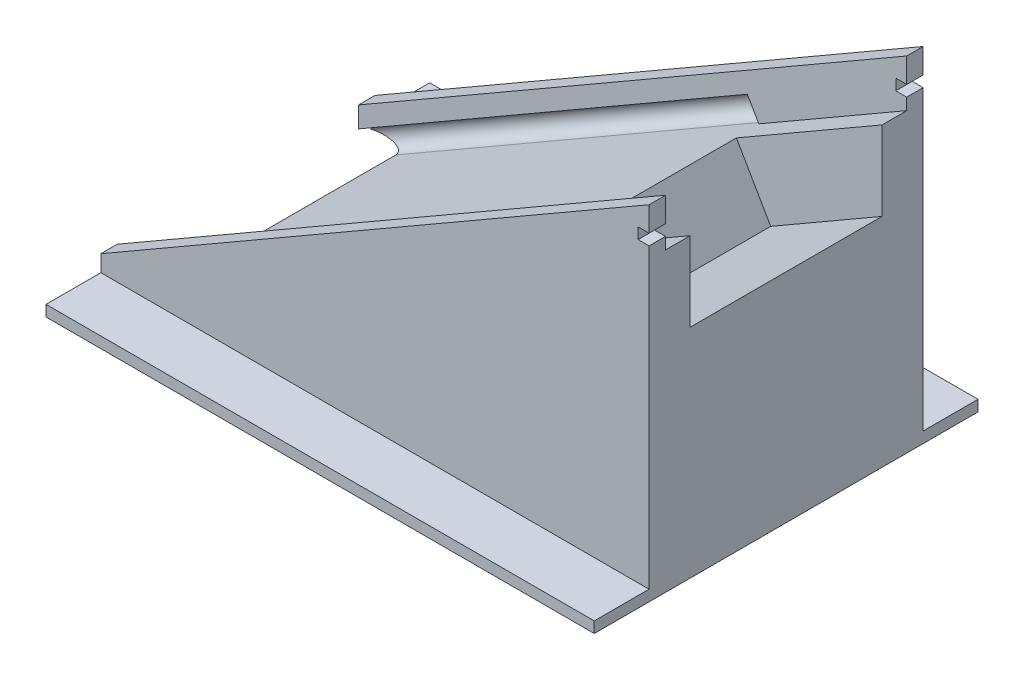
ISO-10303-21;
HEADER;
FILE_DESCRIPTION(('STEP AP214'),'2;1');
FILE_NAME('part.step','',(''),(''),'','','');
FILE_SCHEMA(('AUTOMOTIVE_DESIGN { 1 0 10303 214 1 1 1 1 }'));
ENDSEC;
DATA;
#1=APPLICATION_CONTEXT('core data for automotive mechanical design processes');
#2=APPLICATION_PROTOCOL_DEFINITION('international standard','automotive_design',2000,#1);
#3=PRODUCT_CONTEXT('',#1,'mechanical');
#4=PRODUCT('Part','Part','',(#3));
#5=PRODUCT_RELATED_PRODUCT_CATEGORY('part','',(#4));
#6=PRODUCT_DEFINITION_FORMATION('','',#4);
#7=PRODUCT_DEFINITION_CONTEXT('part definition',#1,'design');
#8=PRODUCT_DEFINITION('design','',#6,#7);
#9=PRODUCT_DEFINITION_SHAPE('','',#8);
#10=(LENGTH_UNIT() NAMED_UNIT(*) SI_UNIT(.MILLI.,.METRE.));
#11=(NAMED_UNIT(*) PLANE_ANGLE_UNIT() SI_UNIT($,.RADIAN.));
#12=(NAMED_UNIT(*) SI_UNIT($,.STERADIAN.) SOLID_ANGLE_UNIT());
#13=UNCERTAINTY_MEASURE_WITH_UNIT(LENGTH_MEASURE(1.E-05),#10,'distance_accuracy_value','');
#14=(GEOMETRIC_REPRESENTATION_CONTEXT(3) GLOBAL_UNCERTAINTY_ASSIGNED_CONTEXT((#13)) GLOBAL_UNIT_ASSIGNED_CONTEXT((#10,
#11,#12)) REPRESENTATION_CONTEXT('',''));
#15=CARTESIAN_POINT('',(0.,0.,0.));
#16=DIRECTION('',(0.,0.,1.));
#17=DIRECTION('',(1.,0.,0.));
#18=AXIS2_PLACEMENT_3D('',#15,#16,#17);
#19=CARTESIAN_POINT('',(50.,2.,35.));
#20=DIRECTION('',(-1.,0.,0.));
#21=DIRECTION('',(0.,0.,1.));
#22=AXIS2_PLACEMENT_3D('',#19,#20,#21);
#23=PLANE('',#22);
#24=DIRECTION('',(0.,1.,0.));
#25=VECTOR('',#24,1.);
#26=CARTESIAN_POINT('',(50.,62.7350269189618,25.));
#27=LINE('',#26,#25);
#28=CARTESIAN_POINT('',(50.,58.2350269189618,25.));
#29=VERTEX_POINT('',#28);
#30=CARTESIAN_POINT('',(50.,62.7350269189618,25.));
#31=VERTEX_POINT('',#30);
#32=EDGE_CURVE('E447',#29,#31,#27,.T.);
#33=ORIENTED_EDGE('',*,*,#32,.F.);
#34=DIRECTION('',(0.,0.,1.));
#35=VECTOR('',#34,1.);
#36=CARTESIAN_POINT('',(50.,58.2350269189618,25.));
#37=LINE('',#36,#35);
#38=CARTESIAN_POINT('',(50.,58.2350269189618,22.));
#39=VERTEX_POINT('',#38);
#40=EDGE_CURVE('E261',#39,#29,#37,.T.);
#41=ORIENTED_EDGE('',*,*,#40,.F.);
#42=DIRECTION('',(0.,1.,0.));
#43=VECTOR('',#42,1.);
#44=CARTESIAN_POINT('',(50.,2.,22.));
#45=LINE('',#44,#43);
#46=CARTESIAN_POINT('',(50.,62.7350269189619,22.));
#47=VERTEX_POINT('',#46);
#48=EDGE_CURVE('E342',#39,#47,#45,.T.);
#49=ORIENTED_EDGE('',*,*,#48,.T.);
#50=DIRECTION('',(0.,0.,-1.));
#51=VECTOR('',#50,1.);
#52=CARTESIAN_POINT('',(50.,62.7350269189618,25.));
#53=LINE('',#52,#51);
#54=EDGE_CURVE('E473',#31,#47,#53,.T.);
#55=ORIENTED_EDGE('',*,*,#54,.F.);
#56=EDGE_LOOP('',(#33,#41,#49,#55));
#57=FACE_BOUND('',#56,.T.);
#58=ADVANCED_FACE('F40',(#57),#23,.F.);
#59=CARTESIAN_POINT('',(50.,54.0971324415937,22.));
#60=VERTEX_POINT('',#59);
#61=CARTESIAN_POINT('',(50.,56.2350269189618,22.));
#62=VERTEX_POINT('',#61);
#63=EDGE_CURVE('E337',#60,#62,#45,.T.);
#64=ORIENTED_EDGE('',*,*,#63,.T.);
#65=DIRECTION('',(0.,0.,-1.));
#66=VECTOR('',#65,1.);
#67=CARTESIAN_POINT('',(50.,56.2350269189618,25.));
#68=LINE('',#67,#66);
#69=CARTESIAN_POINT('',(50.,56.2350269189618,25.));
#70=VERTEX_POINT('',#69);
#71=EDGE_CURVE('E300',#70,#62,#68,.T.);
#72=ORIENTED_EDGE('',*,*,#71,.F.);
#73=CARTESIAN_POINT('',(50.,2.,25.));
#74=VERTEX_POINT('',#73);
#75=EDGE_CURVE('E267',#74,#70,#27,.T.);
#76=ORIENTED_EDGE('',*,*,#75,.F.);
#77=DIRECTION('',(0.,0.,-1.));
#78=VECTOR('',#77,1.);
#79=CARTESIAN_POINT('',(50.,2.,35.));
#80=LINE('',#79,#78);
#81=CARTESIAN_POINT('',(50.,2.,35.));
#82=VERTEX_POINT('',#81);
#83=EDGE_CURVE('E478',#82,#74,#80,.T.);
#84=ORIENTED_EDGE('',*,*,#83,.F.);
#85=DIRECTION('',(0.,-1.,0.));
#86=VECTOR('',#85,1.);
#87=CARTESIAN_POINT('',(50.,2.,35.));
#88=LINE('',#87,#86);
#89=CARTESIAN_POINT('',(50.,0.,35.));
#90=VERTEX_POINT('',#89);
#91=EDGE_CURVE('E492',#82,#90,#88,.T.);
#92=ORIENTED_EDGE('',*,*,#91,.T.);
#93=DIRECTION('',(0.,0.,-1.));
#94=VECTOR('',#93,1.);
#95=CARTESIAN_POINT('',(50.,0.,35.));
#96=LINE('',#95,#94);
#97=CARTESIAN_POINT('',(50.,0.,-35.));
#98=VERTEX_POINT('',#97);
#99=EDGE_CURVE('E477',#90,#98,#96,.T.);
#100=ORIENTED_EDGE('',*,*,#99,.T.);
#101=DIRECTION('',(0.,-1.,0.));
#102=VECTOR('',#101,1.);
#103=CARTESIAN_POINT('',(50.,2.,-35.));
#104=LINE('',#103,#102);
#105=CARTESIAN_POINT('',(50.,2.,-35.));
#106=VERTEX_POINT('',#105);
#107=EDGE_CURVE('E518',#106,#98,#104,.T.);
#108=ORIENTED_EDGE('',*,*,#107,.F.);
#109=CARTESIAN_POINT('',(50.,2.,-25.));
#110=VERTEX_POINT('',#109);
#111=EDGE_CURVE('E482',#110,#106,#80,.T.);
#112=ORIENTED_EDGE('',*,*,#111,.F.);
#113=DIRECTION('',(0.,1.,0.));
#114=VECTOR('',#113,1.);
#115=CARTESIAN_POINT('',(50.,62.7350269189618,-25.));
#116=LINE('',#115,#114);
#117=CARTESIAN_POINT('',(50.,56.2350269189618,-25.));
#118=VERTEX_POINT('',#117);
#119=EDGE_CURVE('E461',#110,#118,#116,.T.);
#120=ORIENTED_EDGE('',*,*,#119,.T.);
#121=DIRECTION('',(0.,0.,-1.));
#122=VECTOR('',#121,1.);
#123=CARTESIAN_POINT('',(50.,56.2350269189618,-25.));
#124=LINE('',#123,#122);
#125=CARTESIAN_POINT('',(50.,56.2350269189618,-22.));
#126=VERTEX_POINT('',#125);
#127=EDGE_CURVE('E280',#126,#118,#124,.T.);
#128=ORIENTED_EDGE('',*,*,#127,.F.);
#129=DIRECTION('',(0.,-1.,0.));
#130=VECTOR('',#129,1.);
#131=CARTESIAN_POINT('',(50.,2.,-22.));
#132=LINE('',#131,#130);
#133=CARTESIAN_POINT('',(50.,54.0971324415937,-22.));
#134=VERTEX_POINT('',#133);
#135=EDGE_CURVE('E341',#126,#134,#132,.T.);
#136=ORIENTED_EDGE('',*,*,#135,.T.);
#137=DIRECTION('',(0.,0.,1.));
#138=VECTOR('',#137,1.);
#139=CARTESIAN_POINT('',(50.,54.0971324415937,35.));
#140=LINE('',#139,#138);
#141=CARTESIAN_POINT('',(50.,54.0971324415937,-17.5));
#142=VERTEX_POINT('',#141);
#143=EDGE_CURVE('E336',#134,#142,#140,.T.);
#144=ORIENTED_EDGE('',*,*,#143,.T.);
#145=DIRECTION('',(0.,-1.,0.));
#146=VECTOR('',#145,1.);
#147=CARTESIAN_POINT('',(50.,2.,-17.5));
#148=LINE('',#147,#146);
#149=CARTESIAN_POINT('',(50.,39.6410161513769,-17.5));
#150=VERTEX_POINT('',#149);
#151=EDGE_CURVE('E428',#142,#150,#148,.T.);
#152=ORIENTED_EDGE('',*,*,#151,.T.);
#153=DIRECTION('',(0.,0.,1.));
#154=VECTOR('',#153,1.);
#155=CARTESIAN_POINT('',(50.,39.6410161513769,35.));
#156=LINE('',#155,#154);
#157=CARTESIAN_POINT('',(50.,39.6410161513769,17.5));
#158=VERTEX_POINT('',#157);
#159=EDGE_CURVE('E522',#150,#158,#156,.T.);
#160=ORIENTED_EDGE('',*,*,#159,.T.);
#161=DIRECTION('',(0.,1.,0.));
#162=VECTOR('',#161,1.);
#163=CARTESIAN_POINT('',(50.,2.,17.5));
#164=LINE('',#163,#162);
#165=CARTESIAN_POINT('',(50.,54.0971324415937,17.5));
#166=VERTEX_POINT('',#165);
#167=EDGE_CURVE('E434',#158,#166,#164,.T.);
#168=ORIENTED_EDGE('',*,*,#167,.T.);
#169=EDGE_CURVE('E332',#166,#60,#140,.T.);
#170=ORIENTED_EDGE('',*,*,#169,.T.);
#171=EDGE_LOOP('',(#64,#72,#76,#84,#92,#100,#108,#112,#120,#128,#136,#144,#152,#160,#168,#170));
#172=FACE_BOUND('',#171,.T.);
#173=ADVANCED_FACE('F622',(#172),#23,.F.);
#174=CARTESIAN_POINT('',(-50.,5.,25.));
#175=DIRECTION('',(0.499999999999995,-0.866025403784441,0.));
#176=DIRECTION('',(0.866025403784442,0.499999999999995,0.));
#177=AXIS2_PLACEMENT_3D('',#174,#175,#176);
#178=PLANE('',#177);
#179=DIRECTION('',(-0.866025403784442,-0.499999999999995,0.));
#180=VECTOR('',#179,1.);
#181=CARTESIAN_POINT('',(131.662207683997,109.882724507936,-22.));
#182=LINE('',#181,#180);
#183=CARTESIAN_POINT('',(50.,62.7350269189619,-22.));
#184=VERTEX_POINT('',#183);
#185=CARTESIAN_POINT('',(-50.,4.99999999999999,-22.));
#186=VERTEX_POINT('',#185);
#187=EDGE_CURVE('E380',#184,#186,#182,.T.);
#188=ORIENTED_EDGE('',*,*,#187,.F.);
#189=CARTESIAN_POINT('',(50.,62.7350269189618,-25.));
#190=VERTEX_POINT('',#189);
#191=EDGE_CURVE('E472',#184,#190,#53,.T.);
#192=ORIENTED_EDGE('',*,*,#191,.T.);
#193=DIRECTION('',(-0.866025403784442,-0.499999999999995,0.));
#194=VECTOR('',#193,1.);
#195=CARTESIAN_POINT('',(-50.,5.,-25.));
#196=LINE('',#195,#194);
#197=CARTESIAN_POINT('',(-50.,5.,-25.));
#198=VERTEX_POINT('',#197);
#199=EDGE_CURVE('E444',#190,#198,#196,.T.);
#200=ORIENTED_EDGE('',*,*,#199,.T.);
#201=DIRECTION('',(0.,0.,-1.));
#202=VECTOR('',#201,1.);
#203=CARTESIAN_POINT('',(-50.,5.,25.));
#204=LINE('',#203,#202);
#205=EDGE_CURVE('E453',#186,#198,#204,.T.);
#206=ORIENTED_EDGE('',*,*,#205,.F.);
#207=EDGE_LOOP('',(#188,#192,#200,#206));
#208=FACE_BOUND('',#207,.T.);
#209=ADVANCED_FACE('F564',(#208),#178,.F.);
#210=CARTESIAN_POINT('',(33.9470958122162,19.5993649053888,0.));
#211=DIRECTION('',(-0.866025403784442,-0.499999999999995,0.));
#212=DIRECTION('',(0.499999999999995,-0.866025403784442,0.));
#213=AXIS2_PLACEMENT_3D('',#210,#211,#212);
#214=PLANE('',#213);
#215=DIRECTION('',(0.499999999999995,-0.866025403784441,0.));
#216=VECTOR('',#215,1.);
#217=CARTESIAN_POINT('',(33.9470958122162,19.5993649053888,-22.));
#218=LINE('',#217,#216);
#219=CARTESIAN_POINT('',(20.9223503290604,42.1588858378681,-22.));
#220=VERTEX_POINT('',#219);
#221=CARTESIAN_POINT('',(23.0223503290603,38.5215791419734,-22.));
#222=VERTEX_POINT('',#221);
#223=EDGE_CURVE('E12',#220,#222,#218,.T.);
#224=ORIENTED_EDGE('',*,*,#223,.F.);
#225=DIRECTION('',(0.,0.,1.));
#226=VECTOR('',#225,1.);
#227=CARTESIAN_POINT('',(20.9223503290604,42.1588858378681,-22.));
#228=LINE('',#227,#226);
#229=CARTESIAN_POINT('',(20.9223503290604,42.1588858378681,-22.5));
#230=VERTEX_POINT('',#229);
#231=EDGE_CURVE('E348',#230,#220,#228,.T.);
#232=ORIENTED_EDGE('',*,*,#231,.F.);
#233=CARTESIAN_POINT('',(21.9723503290604,40.3402324899208,-22.5));
#234=DIRECTION('',(-0.866025403784442,-0.499999999999995,0.));
#235=DIRECTION('',(0.499999999999995,-0.866025403784442,0.));
#236=AXIS2_PLACEMENT_3D('',#233,#234,#235);
#237=CIRCLE('',#236,2.1);
#238=CARTESIAN_POINT('',(23.0223503290603,38.5215791419735,-22.5));
#239=VERTEX_POINT('',#238);
#240=EDGE_CURVE('E352',#239,#230,#237,.F.);
#241=ORIENTED_EDGE('',*,*,#240,.F.);
#242=DIRECTION('',(0.,0.,-1.));
#243=VECTOR('',#242,1.);
#244=CARTESIAN_POINT('',(23.0223503290603,38.5215791419734,22.5));
#245=LINE('',#244,#243);
#246=EDGE_CURVE('E356',#222,#239,#245,.T.);
#247=ORIENTED_EDGE('',*,*,#246,.F.);
#248=EDGE_LOOP('',(#224,#232,#241,#247));
#249=FACE_BOUND('',#248,.T.);
#250=ADVANCED_FACE('F555',(#249),#214,.T.);
#251=CARTESIAN_POINT('',(-50.,2.,35.));
#252=DIRECTION('',(1.,0.,0.));
#253=DIRECTION('',(0.,0.,-1.));
#254=AXIS2_PLACEMENT_3D('',#251,#252,#253);
#255=PLANE('',#254);
#256=DIRECTION('',(0.,0.,1.));
#257=VECTOR('',#256,1.);
#258=CARTESIAN_POINT('',(-50.,0.,35.));
#259=LINE('',#258,#257);
#260=CARTESIAN_POINT('',(-50.,0.,-35.));
#261=VERTEX_POINT('',#260);
#262=CARTESIAN_POINT('',(-50.,0.,-24.3183593622109));
#263=VERTEX_POINT('',#262);
#264=EDGE_CURVE('E500',#261,#263,#259,.T.);
#265=ORIENTED_EDGE('',*,*,#264,.T.);
#266=CARTESIAN_POINT('',(-50.,-1.21302334677169,-22.5));
#267=DIRECTION('',(1.,0.,0.));
#268=DIRECTION('',(0.,-1.,0.));
#269=AXIS2_PLACEMENT_3D('',#266,#267,#268);
#270=ELLIPSE('',#269,2.42487113059642,2.1);
#271=CARTESIAN_POINT('',(-50.,1.21184778382472,-22.5));
#272=VERTEX_POINT('',#271);
#273=EDGE_CURVE('E404',#263,#272,#270,.T.);
#274=ORIENTED_EDGE('',*,*,#273,.T.);
#275=DIRECTION('',(0.,0.,1.));
#276=VECTOR('',#275,1.);
#277=CARTESIAN_POINT('',(-50.,1.21184778382474,35.));
#278=LINE('',#277,#276);
#279=CARTESIAN_POINT('',(-50.,1.21184778382474,-22.));
#280=VERTEX_POINT('',#279);
#281=EDGE_CURVE('E49',#272,#280,#278,.T.);
#282=ORIENTED_EDGE('',*,*,#281,.T.);
#283=DIRECTION('',(0.,1.,0.));
#284=VECTOR('',#283,1.);
#285=CARTESIAN_POINT('',(-50.,2.,-22.));
#286=LINE('',#285,#284);
#287=EDGE_CURVE('E400',#280,#186,#286,.T.);
#288=ORIENTED_EDGE('',*,*,#287,.T.);
#289=ORIENTED_EDGE('',*,*,#205,.T.);
#290=DIRECTION('',(0.,-1.,0.));
#291=VECTOR('',#290,1.);
#292=CARTESIAN_POINT('',(-50.,2.,-25.));
#293=LINE('',#292,#291);
#294=CARTESIAN_POINT('',(-50.,2.,-25.));
#295=VERTEX_POINT('',#294);
#296=EDGE_CURVE('E438',#198,#295,#293,.T.);
#297=ORIENTED_EDGE('',*,*,#296,.T.);
#298=DIRECTION('',(0.,0.,1.));
#299=VECTOR('',#298,1.);
#300=CARTESIAN_POINT('',(-50.,2.,35.));
#301=LINE('',#300,#299);
#302=CARTESIAN_POINT('',(-50.,2.,-35.));
#303=VERTEX_POINT('',#302);
#304=EDGE_CURVE('E486',#303,#295,#301,.T.);
#305=ORIENTED_EDGE('',*,*,#304,.F.);
#306=DIRECTION('',(0.,-1.,0.));
#307=VECTOR('',#306,1.);
#308=CARTESIAN_POINT('',(-50.,2.,-35.));
#309=LINE('',#308,#307);
#310=EDGE_CURVE('E514',#303,#261,#309,.T.);
#311=ORIENTED_EDGE('',*,*,#310,.T.);
#312=EDGE_LOOP('',(#265,#274,#282,#288,#289,#297,#305,#311));
#313=FACE_BOUND('',#312,.T.);
#314=ADVANCED_FACE('F541',(#313),#255,.F.);
#315=CARTESIAN_POINT('',(0.,2.,0.));
#316=DIRECTION('',(0.,-1.,0.));
#317=DIRECTION('',(0.,0.,-1.));
#318=AXIS2_PLACEMENT_3D('',#315,#316,#317);
#319=PLANE('',#318);
#320=DIRECTION('',(1.,0.,0.));
#321=VECTOR('',#320,1.);
#322=CARTESIAN_POINT('',(50.,2.,25.));
#323=LINE('',#322,#321);
#324=CARTESIAN_POINT('',(-50.,2.,25.));
#325=VERTEX_POINT('',#324);
#326=EDGE_CURVE('E443',#325,#74,#323,.T.);
#327=ORIENTED_EDGE('',*,*,#326,.F.);
#328=CARTESIAN_POINT('',(-50.,2.,35.));
#329=VERTEX_POINT('',#328);
#330=EDGE_CURVE('E485',#325,#329,#301,.T.);
#331=ORIENTED_EDGE('',*,*,#330,.T.);
#332=DIRECTION('',(1.,0.,0.));
#333=VECTOR('',#332,1.);
#334=CARTESIAN_POINT('',(-50.,2.,35.));
#335=LINE('',#334,#333);
#336=EDGE_CURVE('E489',#329,#82,#335,.T.);
#337=ORIENTED_EDGE('',*,*,#336,.T.);
#338=ORIENTED_EDGE('',*,*,#83,.T.);
#339=EDGE_LOOP('',(#327,#331,#337,#338));
#340=FACE_BOUND('',#339,.T.);
#341=ADVANCED_FACE('F625',(#340),#319,.F.);
#342=CARTESIAN_POINT('',(50.,58.2350269189618,-22.));
#343=VERTEX_POINT('',#342);
#344=EDGE_CURVE('E343',#184,#343,#132,.T.);
#345=ORIENTED_EDGE('',*,*,#344,.T.);
#346=DIRECTION('',(0.,0.,1.));
#347=VECTOR('',#346,1.);
#348=CARTESIAN_POINT('',(50.,58.2350269189618,-25.));
#349=LINE('',#348,#347);
#350=CARTESIAN_POINT('',(50.,58.2350269189618,-25.));
#351=VERTEX_POINT('',#350);
#352=EDGE_CURVE('E291',#351,#343,#349,.T.);
#353=ORIENTED_EDGE('',*,*,#352,.F.);
#354=EDGE_CURVE('E460',#351,#190,#116,.T.);
#355=ORIENTED_EDGE('',*,*,#354,.T.);
#356=ORIENTED_EDGE('',*,*,#191,.F.);
#357=EDGE_LOOP('',(#345,#353,#355,#356));
#358=FACE_BOUND('',#357,.T.);
#359=ADVANCED_FACE('F42',(#358),#23,.F.);
#360=CARTESIAN_POINT('',(-50.,2.,-35.));
#361=DIRECTION('',(0.,0.,1.));
#362=DIRECTION('',(1.,0.,0.));
#363=AXIS2_PLACEMENT_3D('',#360,#361,#362);
#364=PLANE('',#363);
#365=DIRECTION('',(-1.,0.,0.));
#366=VECTOR('',#365,1.);
#367=CARTESIAN_POINT('',(-50.,0.,-35.));
#368=LINE('',#367,#366);
#369=EDGE_CURVE('E496',#98,#261,#368,.T.);
#370=ORIENTED_EDGE('',*,*,#369,.T.);
#371=ORIENTED_EDGE('',*,*,#310,.F.);
#372=DIRECTION('',(-1.,0.,0.));
#373=VECTOR('',#372,1.);
#374=CARTESIAN_POINT('',(-50.,2.,-35.));
#375=LINE('',#374,#373);
#376=EDGE_CURVE('E481',#106,#303,#375,.T.);
#377=ORIENTED_EDGE('',*,*,#376,.F.);
#378=ORIENTED_EDGE('',*,*,#107,.T.);
#379=EDGE_LOOP('',(#370,#371,#377,#378));
#380=FACE_BOUND('',#379,.T.);
#381=ADVANCED_FACE('F633',(#380),#364,.F.);
#382=DIRECTION('',(0.,0.,1.));
#383=VECTOR('',#382,1.);
#384=CARTESIAN_POINT('',(-50.,1.21184778382474,35.));
#385=LINE('',#384,#383);
#386=CARTESIAN_POINT('',(-50.,1.21184778382472,22.));
#387=VERTEX_POINT('',#386);
#388=CARTESIAN_POINT('',(-50.,1.21184778382472,22.5));
#389=VERTEX_POINT('',#388);
#390=EDGE_CURVE('E535',#387,#389,#385,.T.);
#391=ORIENTED_EDGE('',*,*,#390,.T.);
#392=CARTESIAN_POINT('',(-50.,-1.21302334677169,22.5));
#393=DIRECTION('',(1.,0.,0.));
#394=DIRECTION('',(0.,-1.,0.));
#395=AXIS2_PLACEMENT_3D('',#392,#393,#394);
#396=ELLIPSE('',#395,2.42487113059642,2.1);
#397=CARTESIAN_POINT('',(-50.,0.,24.3183593622109));
#398=VERTEX_POINT('',#397);
#399=EDGE_CURVE('E408',#389,#398,#396,.T.);
#400=ORIENTED_EDGE('',*,*,#399,.T.);
#401=CARTESIAN_POINT('',(-50.,0.,35.));
#402=VERTEX_POINT('',#401);
#403=EDGE_CURVE('E499',#398,#402,#259,.T.);
#404=ORIENTED_EDGE('',*,*,#403,.T.);
#405=DIRECTION('',(0.,-1.,0.));
#406=VECTOR('',#405,1.);
#407=CARTESIAN_POINT('',(-50.,2.,35.));
#408=LINE('',#407,#406);
#409=EDGE_CURVE('E510',#329,#402,#408,.T.);
#410=ORIENTED_EDGE('',*,*,#409,.F.);
#411=ORIENTED_EDGE('',*,*,#330,.F.);
#412=DIRECTION('',(0.,-1.,0.));
#413=VECTOR('',#412,1.);
#414=CARTESIAN_POINT('',(-50.,2.,25.));
#415=LINE('',#414,#413);
#416=CARTESIAN_POINT('',(-50.,5.,25.));
#417=VERTEX_POINT('',#416);
#418=EDGE_CURVE('E439',#417,#325,#415,.T.);
#419=ORIENTED_EDGE('',*,*,#418,.F.);
#420=CARTESIAN_POINT('',(-50.,4.99999999999999,22.));
#421=VERTEX_POINT('',#420);
#422=EDGE_CURVE('E468',#417,#421,#204,.T.);
#423=ORIENTED_EDGE('',*,*,#422,.T.);
#424=DIRECTION('',(0.,-1.,0.));
#425=VECTOR('',#424,1.);
#426=CARTESIAN_POINT('',(-50.,2.,22.));
#427=LINE('',#426,#425);
#428=EDGE_CURVE('E396',#421,#387,#427,.T.);
#429=ORIENTED_EDGE('',*,*,#428,.T.);
#430=EDGE_LOOP('',(#391,#400,#404,#410,#411,#419,#423,#429));
#431=FACE_BOUND('',#430,.T.);
#432=ADVANCED_FACE('F603',(#431),#255,.F.);
#433=CARTESIAN_POINT('',(-50.,2.,35.));
#434=DIRECTION('',(0.,0.,-1.));
#435=DIRECTION('',(-1.,0.,0.));
#436=AXIS2_PLACEMENT_3D('',#433,#434,#435);
#437=PLANE('',#436);
#438=DIRECTION('',(1.,0.,0.));
#439=VECTOR('',#438,1.);
#440=CARTESIAN_POINT('',(-50.,0.,35.));
#441=LINE('',#440,#439);
#442=EDGE_CURVE('E504',#402,#90,#441,.T.);
#443=ORIENTED_EDGE('',*,*,#442,.T.);
#444=ORIENTED_EDGE('',*,*,#91,.F.);
#445=ORIENTED_EDGE('',*,*,#336,.F.);
#446=ORIENTED_EDGE('',*,*,#409,.T.);
#447=EDGE_LOOP('',(#443,#444,#445,#446));
#448=FACE_BOUND('',#447,.T.);
#449=ADVANCED_FACE('F615',(#448),#437,.F.);
#450=ORIENTED_EDGE('',*,*,#304,.T.);
#451=DIRECTION('',(1.,0.,0.));
#452=VECTOR('',#451,1.);
#453=CARTESIAN_POINT('',(50.,2.,-25.));
#454=LINE('',#453,#452);
#455=EDGE_CURVE('E457',#295,#110,#454,.T.);
#456=ORIENTED_EDGE('',*,*,#455,.T.);
#457=ORIENTED_EDGE('',*,*,#111,.T.);
#458=ORIENTED_EDGE('',*,*,#376,.T.);
#459=EDGE_LOOP('',(#450,#456,#457,#458));
#460=FACE_BOUND('',#459,.T.);
#461=ADVANCED_FACE('F628',(#460),#319,.F.);
#462=CARTESIAN_POINT('',(0.,0.,0.));
#463=DIRECTION('',(0.,-1.,0.));
#464=DIRECTION('',(0.,0.,-1.));
#465=AXIS2_PLACEMENT_3D('',#462,#463,#464);
#466=PLANE('',#465);
#467=CARTESIAN_POINT('',(-47.8989819326242,0.,22.5));
#468=DIRECTION('',(0.,-1.,0.));
#469=DIRECTION('',(-1.,0.,0.));
#470=AXIS2_PLACEMENT_3D('',#467,#468,#469);
#471=ELLIPSE('',#470,4.20000000000004,2.1);
#472=CARTESIAN_POINT('',(-43.6989819326241,0.,22.5));
#473=VERTEX_POINT('',#472);
#474=EDGE_CURVE('E532',#473,#398,#471,.T.);
#475=ORIENTED_EDGE('',*,*,#474,.F.);
#476=DIRECTION('',(0.,0.,1.));
#477=VECTOR('',#476,1.);
#478=CARTESIAN_POINT('',(-43.6989819326241,0.,0.));
#479=LINE('',#478,#477);
#480=CARTESIAN_POINT('',(-43.6989819326241,0.,-22.5));
#481=VERTEX_POINT('',#480);
#482=EDGE_CURVE('E529',#481,#473,#479,.T.);
#483=ORIENTED_EDGE('',*,*,#482,.F.);
#484=CARTESIAN_POINT('',(-47.8989819326242,0.,-22.5));
#485=DIRECTION('',(0.,-1.,0.));
#486=DIRECTION('',(-1.,0.,0.));
#487=AXIS2_PLACEMENT_3D('',#484,#485,#486);
#488=ELLIPSE('',#487,4.20000000000004,2.1);
#489=EDGE_CURVE('E526',#263,#481,#488,.T.);
#490=ORIENTED_EDGE('',*,*,#489,.F.);
#491=ORIENTED_EDGE('',*,*,#264,.F.);
#492=ORIENTED_EDGE('',*,*,#369,.F.);
#493=ORIENTED_EDGE('',*,*,#99,.F.);
#494=ORIENTED_EDGE('',*,*,#442,.F.);
#495=ORIENTED_EDGE('',*,*,#403,.F.);
#496=EDGE_LOOP('',(#475,#483,#490,#491,#492,#493,#494,#495));
#497=FACE_BOUND('',#496,.T.);
#498=ADVANCED_FACE('F618',(#497),#466,.T.);
#499=ORIENTED_EDGE('',*,*,#54,.T.);
#500=DIRECTION('',(-0.866025403784442,-0.499999999999995,0.));
#501=VECTOR('',#500,1.);
#502=CARTESIAN_POINT('',(131.662207683997,109.882724507936,22.));
#503=LINE('',#502,#501);
#504=EDGE_CURVE('E383',#47,#421,#503,.T.);
#505=ORIENTED_EDGE('',*,*,#504,.T.);
#506=ORIENTED_EDGE('',*,*,#422,.F.);
#507=DIRECTION('',(-0.866025403784442,-0.499999999999995,0.));
#508=VECTOR('',#507,1.);
#509=CARTESIAN_POINT('',(-50.,5.,25.));
#510=LINE('',#509,#508);
#511=EDGE_CURVE('E450',#31,#417,#510,.T.);
#512=ORIENTED_EDGE('',*,*,#511,.F.);
#513=EDGE_LOOP('',(#499,#505,#506,#512));
#514=FACE_BOUND('',#513,.T.);
#515=ADVANCED_FACE('F600',(#514),#178,.F.);
#516=CARTESIAN_POINT('',(0.,0.,25.));
#517=DIRECTION('',(0.,0.,1.));
#518=DIRECTION('',(1.,0.,0.));
#519=AXIS2_PLACEMENT_3D('',#516,#517,#518);
#520=PLANE('',#519);
#521=DIRECTION('',(1.,0.,0.));
#522=VECTOR('',#521,1.);
#523=CARTESIAN_POINT('',(48.,58.2350269189618,25.));
#524=LINE('',#523,#522);
#525=CARTESIAN_POINT('',(48.,58.2350269189618,25.));
#526=VERTEX_POINT('',#525);
#527=EDGE_CURVE('E314',#526,#29,#524,.T.);
#528=ORIENTED_EDGE('',*,*,#527,.T.);
#529=ORIENTED_EDGE('',*,*,#32,.T.);
#530=ORIENTED_EDGE('',*,*,#511,.T.);
#531=ORIENTED_EDGE('',*,*,#418,.T.);
#532=ORIENTED_EDGE('',*,*,#326,.T.);
#533=ORIENTED_EDGE('',*,*,#75,.T.);
#534=DIRECTION('',(1.,0.,0.));
#535=VECTOR('',#534,1.);
#536=CARTESIAN_POINT('',(48.,56.2350269189618,25.));
#537=LINE('',#536,#535);
#538=CARTESIAN_POINT('',(48.,56.2350269189618,25.));
#539=VERTEX_POINT('',#538);
#540=EDGE_CURVE('E244',#539,#70,#537,.T.);
#541=ORIENTED_EDGE('',*,*,#540,.F.);
#542=DIRECTION('',(0.,-1.,0.));
#543=VECTOR('',#542,1.);
#544=CARTESIAN_POINT('',(48.,56.2350269189618,25.));
#545=LINE('',#544,#543);
#546=EDGE_CURVE('E251',#526,#539,#545,.T.);
#547=ORIENTED_EDGE('',*,*,#546,.F.);
#548=EDGE_LOOP('',(#528,#529,#530,#531,#532,#533,#541,#547));
#549=FACE_BOUND('',#548,.T.);
#550=ADVANCED_FACE('F264',(#549),#520,.T.);
#551=CARTESIAN_POINT('',(0.,0.,-25.));
#552=DIRECTION('',(0.,0.,1.));
#553=DIRECTION('',(1.,0.,0.));
#554=AXIS2_PLACEMENT_3D('',#551,#552,#553);
#555=PLANE('',#554);
#556=DIRECTION('',(0.,1.,0.));
#557=VECTOR('',#556,1.);
#558=CARTESIAN_POINT('',(48.,56.2350269189618,-25.));
#559=LINE('',#558,#557);
#560=CARTESIAN_POINT('',(48.,56.2350269189618,-25.));
#561=VERTEX_POINT('',#560);
#562=CARTESIAN_POINT('',(48.,58.2350269189618,-25.));
#563=VERTEX_POINT('',#562);
#564=EDGE_CURVE('E277',#561,#563,#559,.T.);
#565=ORIENTED_EDGE('',*,*,#564,.F.);
#566=DIRECTION('',(1.,0.,0.));
#567=VECTOR('',#566,1.);
#568=CARTESIAN_POINT('',(48.,56.2350269189618,-25.));
#569=LINE('',#568,#567);
#570=EDGE_CURVE('E296',#561,#118,#569,.T.);
#571=ORIENTED_EDGE('',*,*,#570,.T.);
#572=ORIENTED_EDGE('',*,*,#119,.F.);
#573=ORIENTED_EDGE('',*,*,#455,.F.);
#574=ORIENTED_EDGE('',*,*,#296,.F.);
#575=ORIENTED_EDGE('',*,*,#199,.F.);
#576=ORIENTED_EDGE('',*,*,#354,.F.);
#577=DIRECTION('',(1.,0.,0.));
#578=VECTOR('',#577,1.);
#579=CARTESIAN_POINT('',(48.,58.2350269189618,-25.));
#580=LINE('',#579,#578);
#581=EDGE_CURVE('E290',#563,#351,#580,.T.);
#582=ORIENTED_EDGE('',*,*,#581,.F.);
#583=EDGE_LOOP('',(#565,#571,#572,#573,#574,#575,#576,#582));
#584=FACE_BOUND('',#583,.T.);
#585=ADVANCED_FACE('F658',(#584),#555,.F.);
#586=CARTESIAN_POINT('',(-4.66506350946094,8.08012701892201,0.));
#587=DIRECTION('',(0.499999999999995,-0.866025403784441,0.));
#588=DIRECTION('',(0.866025403784441,0.499999999999995,0.));
#589=AXIS2_PLACEMENT_3D('',#586,#587,#588);
#590=PLANE('',#589);
#591=DIRECTION('',(-0.866025403784441,-0.499999999999995,0.));
#592=VECTOR('',#591,1.);
#593=CARTESIAN_POINT('',(59.9999999999999,45.414518843273,-17.5));
#594=LINE('',#593,#592);
#595=CARTESIAN_POINT('',(29.6891108675445,27.9145188432732,-17.5));
#596=VERTEX_POINT('',#595);
#597=EDGE_CURVE('E412',#150,#596,#594,.T.);
#598=ORIENTED_EDGE('',*,*,#597,.T.);
#599=DIRECTION('',(0.,0.,1.));
#600=VECTOR('',#599,1.);
#601=CARTESIAN_POINT('',(29.6891108675445,27.9145188432732,-17.5));
#602=LINE('',#601,#600);
#603=CARTESIAN_POINT('',(29.6891108675445,27.9145188432732,17.5));
#604=VERTEX_POINT('',#603);
#605=EDGE_CURVE('E415',#596,#604,#602,.T.);
#606=ORIENTED_EDGE('',*,*,#605,.T.);
#607=DIRECTION('',(0.866025403784441,0.499999999999995,0.));
#608=VECTOR('',#607,1.);
#609=CARTESIAN_POINT('',(59.9999999999999,45.414518843273,17.5));
#610=LINE('',#609,#608);
#611=EDGE_CURVE('E419',#604,#158,#610,.T.);
#612=ORIENTED_EDGE('',*,*,#611,.T.);
#613=ORIENTED_EDGE('',*,*,#159,.F.);
#614=EDGE_LOOP('',(#598,#606,#612,#613));
#615=FACE_BOUND('',#614,.T.);
#616=ADVANCED_FACE('F724',(#615),#590,.F.);
#617=CARTESIAN_POINT('',(59.9999999999999,45.414518843273,17.5));
#618=DIRECTION('',(0.,0.,1.));
#619=DIRECTION('',(1.,0.,0.));
#620=AXIS2_PLACEMENT_3D('',#617,#618,#619);
#621=PLANE('',#620);
#622=DIRECTION('',(-0.499999999999995,0.866025403784441,0.));
#623=VECTOR('',#622,1.);
#624=CARTESIAN_POINT('',(29.6891108675445,27.9145188432732,17.5));
#625=LINE('',#624,#623);
#626=CARTESIAN_POINT('',(23.4294288938496,38.7566060609359,17.5));
#627=VERTEX_POINT('',#626);
#628=EDGE_CURVE('E424',#604,#627,#625,.T.);
#629=ORIENTED_EDGE('',*,*,#628,.T.);
#630=DIRECTION('',(0.866025403784441,0.499999999999995,0.));
#631=VECTOR('',#630,1.);
#632=CARTESIAN_POINT('',(53.740318026305,56.2566060609357,17.5));
#633=LINE('',#632,#631);
#634=EDGE_CURVE('E328',#627,#166,#633,.T.);
#635=ORIENTED_EDGE('',*,*,#634,.T.);
#636=ORIENTED_EDGE('',*,*,#167,.F.);
#637=ORIENTED_EDGE('',*,*,#611,.F.);
#638=EDGE_LOOP('',(#629,#635,#636,#637));
#639=FACE_BOUND('',#638,.T.);
#640=ADVANCED_FACE('F727',(#639),#621,.F.);
#641=CARTESIAN_POINT('',(59.9999999999999,45.414518843273,-17.5));
#642=DIRECTION('',(0.,0.,-1.));
#643=DIRECTION('',(-1.,0.,0.));
#644=AXIS2_PLACEMENT_3D('',#641,#642,#643);
#645=PLANE('',#644);
#646=ORIENTED_EDGE('',*,*,#151,.F.);
#647=DIRECTION('',(-0.866025403784441,-0.499999999999995,0.));
#648=VECTOR('',#647,1.);
#649=CARTESIAN_POINT('',(53.740318026305,56.2566060609357,-17.5));
#650=LINE('',#649,#648);
#651=CARTESIAN_POINT('',(23.4294288938496,38.7566060609359,-17.5));
#652=VERTEX_POINT('',#651);
#653=EDGE_CURVE('E324',#142,#652,#650,.T.);
#654=ORIENTED_EDGE('',*,*,#653,.T.);
#655=DIRECTION('',(-0.499999999999995,0.866025403784441,0.));
#656=VECTOR('',#655,1.);
#657=CARTESIAN_POINT('',(29.6891108675445,27.9145188432732,-17.5));
#658=LINE('',#657,#656);
#659=EDGE_CURVE('E423',#596,#652,#658,.T.);
#660=ORIENTED_EDGE('',*,*,#659,.F.);
#661=ORIENTED_EDGE('',*,*,#597,.F.);
#662=EDGE_LOOP('',(#646,#654,#660,#661));
#663=FACE_BOUND('',#662,.T.);
#664=ADVANCED_FACE('F731',(#663),#645,.F.);
#665=CARTESIAN_POINT('',(29.6891108675445,27.9145188432732,-17.5));
#666=DIRECTION('',(-0.866025403784441,-0.499999999999995,0.));
#667=DIRECTION('',(0.499999999999995,-0.866025403784441,0.));
#668=AXIS2_PLACEMENT_3D('',#665,#666,#667);
#669=PLANE('',#668);
#670=ORIENTED_EDGE('',*,*,#659,.T.);
#671=DIRECTION('',(0.,0.,1.));
#672=VECTOR('',#671,1.);
#673=CARTESIAN_POINT('',(23.4294288938496,38.7566060609359,-17.5));
#674=LINE('',#673,#672);
#675=EDGE_CURVE('E318',#652,#627,#674,.T.);
#676=ORIENTED_EDGE('',*,*,#675,.T.);
#677=ORIENTED_EDGE('',*,*,#628,.F.);
#678=ORIENTED_EDGE('',*,*,#605,.F.);
#679=EDGE_LOOP('',(#670,#676,#677,#678));
#680=FACE_BOUND('',#679,.T.);
#681=ADVANCED_FACE('F713',(#680),#669,.F.);
#682=CARTESIAN_POINT('',(133.302525710302,107.041610345805,-22.));
#683=DIRECTION('',(-0.499999999999995,0.866025403784442,0.));
#684=DIRECTION('',(-0.866025403784442,-0.499999999999995,0.));
#685=AXIS2_PLACEMENT_3D('',#682,#683,#684);
#686=PLANE('',#685);
#687=DIRECTION('',(-0.866025403784442,-0.499999999999995,0.));
#688=VECTOR('',#687,1.);
#689=CARTESIAN_POINT('',(133.302525710302,107.041610345805,-22.5));
#690=LINE('',#689,#688);
#691=EDGE_CURVE('E372',#230,#272,#690,.T.);
#692=ORIENTED_EDGE('',*,*,#691,.F.);
#693=ORIENTED_EDGE('',*,*,#231,.T.);
#694=DIRECTION('',(-0.866025403784442,-0.499999999999995,0.));
#695=VECTOR('',#694,1.);
#696=CARTESIAN_POINT('',(133.302525710302,107.041610345805,-22.));
#697=LINE('',#696,#695);
#698=EDGE_CURVE('E376',#220,#280,#697,.T.);
#699=ORIENTED_EDGE('',*,*,#698,.T.);
#700=ORIENTED_EDGE('',*,*,#281,.F.);
#701=EDGE_LOOP('',(#692,#693,#699,#700));
#702=FACE_BOUND('',#701,.T.);
#703=ADVANCED_FACE('F545',(#702),#686,.F.);
#704=CARTESIAN_POINT('',(133.302525710302,107.041610345805,22.5));
#705=DIRECTION('',(-0.499999999999995,0.866025403784442,0.));
#706=DIRECTION('',(-0.866025403784442,-0.499999999999995,0.));
#707=AXIS2_PLACEMENT_3D('',#704,#705,#706);
#708=PLANE('',#707);
#709=DIRECTION('',(-0.866025403784442,-0.499999999999995,0.));
#710=VECTOR('',#709,1.);
#711=CARTESIAN_POINT('',(133.302525710302,107.041610345805,22.));
#712=LINE('',#711,#710);
#713=CARTESIAN_POINT('',(20.9223503290604,42.1588858378681,22.));
#714=VERTEX_POINT('',#713);
#715=EDGE_CURVE('E387',#714,#387,#712,.T.);
#716=ORIENTED_EDGE('',*,*,#715,.F.);
#717=DIRECTION('',(0.,0.,1.));
#718=VECTOR('',#717,1.);
#719=CARTESIAN_POINT('',(20.9223503290604,42.1588858378681,22.5));
#720=LINE('',#719,#718);
#721=CARTESIAN_POINT('',(20.9223503290604,42.1588858378681,22.5));
#722=VERTEX_POINT('',#721);
#723=EDGE_CURVE('E364',#714,#722,#720,.T.);
#724=ORIENTED_EDGE('',*,*,#723,.T.);
#725=DIRECTION('',(-0.866025403784442,-0.499999999999995,0.));
#726=VECTOR('',#725,1.);
#727=CARTESIAN_POINT('',(133.302525710302,107.041610345805,22.5));
#728=LINE('',#727,#726);
#729=EDGE_CURVE('E347',#722,#389,#728,.T.);
#730=ORIENTED_EDGE('',*,*,#729,.T.);
#731=ORIENTED_EDGE('',*,*,#390,.F.);
#732=EDGE_LOOP('',(#716,#724,#730,#731));
#733=FACE_BOUND('',#732,.T.);
#734=ADVANCED_FACE('F712',(#733),#708,.F.);
#735=CARTESIAN_POINT('',(134.352525710302,105.222956997857,22.5));
#736=DIRECTION('',(-0.866025403784442,-0.499999999999995,0.));
#737=DIRECTION('',(0.499999999999995,-0.866025403784442,0.));
#738=AXIS2_PLACEMENT_3D('',#735,#736,#737);
#739=CYLINDRICAL_SURFACE('',#738,2.1);
#740=ORIENTED_EDGE('',*,*,#729,.F.);
#741=CARTESIAN_POINT('',(21.9723503290604,40.3402324899208,22.5));
#742=DIRECTION('',(-0.866025403784442,-0.499999999999995,0.));
#743=DIRECTION('',(0.499999999999995,-0.866025403784442,0.));
#744=AXIS2_PLACEMENT_3D('',#741,#742,#743);
#745=CIRCLE('',#744,2.1);
#746=CARTESIAN_POINT('',(23.0223503290603,38.5215791419734,22.5));
#747=VERTEX_POINT('',#746);
#748=EDGE_CURVE('E361',#722,#747,#745,.F.);
#749=ORIENTED_EDGE('',*,*,#748,.T.);
#750=DIRECTION('',(-0.866025403784442,-0.499999999999995,0.));
#751=VECTOR('',#750,1.);
#752=CARTESIAN_POINT('',(135.402525710302,103.40430364991,22.5));
#753=LINE('',#752,#751);
#754=EDGE_CURVE('E353',#747,#473,#753,.T.);
#755=ORIENTED_EDGE('',*,*,#754,.T.);
#756=ORIENTED_EDGE('',*,*,#474,.T.);
#757=ORIENTED_EDGE('',*,*,#399,.F.);
#758=EDGE_LOOP('',(#740,#749,#755,#756,#757));
#759=FACE_BOUND('',#758,.T.);
#760=ADVANCED_FACE('F709',(#759),#739,.F.);
#761=CARTESIAN_POINT('',(134.352525710302,105.222956997857,-22.5));
#762=DIRECTION('',(-0.866025403784442,-0.499999999999995,0.));
#763=DIRECTION('',(0.499999999999995,-0.866025403784442,0.));
#764=AXIS2_PLACEMENT_3D('',#761,#762,#763);
#765=CYLINDRICAL_SURFACE('',#764,2.1);
#766=ORIENTED_EDGE('',*,*,#489,.T.);
#767=DIRECTION('',(-0.866025403784442,-0.499999999999995,0.));
#768=VECTOR('',#767,1.);
#769=CARTESIAN_POINT('',(135.402525710302,103.40430364991,-22.5));
#770=LINE('',#769,#768);
#771=EDGE_CURVE('E368',#239,#481,#770,.T.);
#772=ORIENTED_EDGE('',*,*,#771,.F.);
#773=ORIENTED_EDGE('',*,*,#240,.T.);
#774=ORIENTED_EDGE('',*,*,#691,.T.);
#775=ORIENTED_EDGE('',*,*,#273,.F.);
#776=EDGE_LOOP('',(#766,#772,#773,#774,#775));
#777=FACE_BOUND('',#776,.T.);
#778=ADVANCED_FACE('F548',(#777),#765,.F.);
#779=CARTESIAN_POINT('',(131.662207683997,109.882724507936,-22.));
#780=DIRECTION('',(0.,0.,-1.));
#781=DIRECTION('',(-1.,0.,0.));
#782=AXIS2_PLACEMENT_3D('',#779,#780,#781);
#783=PLANE('',#782);
#784=ORIENTED_EDGE('',*,*,#135,.F.);
#785=DIRECTION('',(1.,0.,0.));
#786=VECTOR('',#785,1.);
#787=CARTESIAN_POINT('',(48.,56.2350269189618,-22.));
#788=LINE('',#787,#786);
#789=CARTESIAN_POINT('',(48.,56.2350269189618,-22.));
#790=VERTEX_POINT('',#789);
#791=EDGE_CURVE('E301',#790,#126,#788,.T.);
#792=ORIENTED_EDGE('',*,*,#791,.F.);
#793=DIRECTION('',(0.,-1.,0.));
#794=VECTOR('',#793,1.);
#795=CARTESIAN_POINT('',(48.,56.2350269189618,-22.));
#796=LINE('',#795,#794);
#797=CARTESIAN_POINT('',(48.,58.2350269189618,-22.));
#798=VERTEX_POINT('',#797);
#799=EDGE_CURVE('E283',#798,#790,#796,.T.);
#800=ORIENTED_EDGE('',*,*,#799,.F.);
#801=DIRECTION('',(1.,0.,0.));
#802=VECTOR('',#801,1.);
#803=CARTESIAN_POINT('',(48.,58.2350269189618,-22.));
#804=LINE('',#803,#802);
#805=EDGE_CURVE('E304',#798,#343,#804,.T.);
#806=ORIENTED_EDGE('',*,*,#805,.T.);
#807=ORIENTED_EDGE('',*,*,#344,.F.);
#808=ORIENTED_EDGE('',*,*,#187,.T.);
#809=ORIENTED_EDGE('',*,*,#287,.F.);
#810=ORIENTED_EDGE('',*,*,#698,.F.);
#811=ORIENTED_EDGE('',*,*,#223,.T.);
#812=DIRECTION('',(-0.866025403784441,-0.499999999999995,0.));
#813=VECTOR('',#812,1.);
#814=CARTESIAN_POINT('',(53.740318026305,56.2566060609357,-22.));
#815=LINE('',#814,#813);
#816=EDGE_CURVE('E313',#134,#222,#815,.T.);
#817=ORIENTED_EDGE('',*,*,#816,.F.);
#818=EDGE_LOOP('',(#784,#792,#800,#806,#807,#808,#809,#810,#811,#817));
#819=FACE_BOUND('',#818,.T.);
#820=ADVANCED_FACE('F558',(#819),#783,.F.);
#821=CARTESIAN_POINT('',(133.302525710302,107.041610345805,22.));
#822=DIRECTION('',(0.,0.,1.));
#823=DIRECTION('',(1.,0.,0.));
#824=AXIS2_PLACEMENT_3D('',#821,#822,#823);
#825=PLANE('',#824);
#826=ORIENTED_EDGE('',*,*,#48,.F.);
#827=DIRECTION('',(1.,0.,0.));
#828=VECTOR('',#827,1.);
#829=CARTESIAN_POINT('',(48.,58.2350269189618,22.));
#830=LINE('',#829,#828);
#831=CARTESIAN_POINT('',(48.,58.2350269189618,22.));
#832=VERTEX_POINT('',#831);
#833=EDGE_CURVE('E272',#832,#39,#830,.T.);
#834=ORIENTED_EDGE('',*,*,#833,.F.);
#835=DIRECTION('',(0.,1.,0.));
#836=VECTOR('',#835,1.);
#837=CARTESIAN_POINT('',(48.,56.2350269189618,22.));
#838=LINE('',#837,#836);
#839=CARTESIAN_POINT('',(48.,56.2350269189618,22.));
#840=VERTEX_POINT('',#839);
#841=EDGE_CURVE('E250',#840,#832,#838,.T.);
#842=ORIENTED_EDGE('',*,*,#841,.F.);
#843=DIRECTION('',(1.,0.,0.));
#844=VECTOR('',#843,1.);
#845=CARTESIAN_POINT('',(48.,56.2350269189618,22.));
#846=LINE('',#845,#844);
#847=EDGE_CURVE('E247',#840,#62,#846,.T.);
#848=ORIENTED_EDGE('',*,*,#847,.T.);
#849=ORIENTED_EDGE('',*,*,#63,.F.);
#850=DIRECTION('',(-0.866025403784441,-0.499999999999995,0.));
#851=VECTOR('',#850,1.);
#852=CARTESIAN_POINT('',(53.740318026305,56.2566060609357,22.));
#853=LINE('',#852,#851);
#854=CARTESIAN_POINT('',(23.0223503290603,38.5215791419735,22.));
#855=VERTEX_POINT('',#854);
#856=EDGE_CURVE('E315',#60,#855,#853,.T.);
#857=ORIENTED_EDGE('',*,*,#856,.T.);
#858=DIRECTION('',(-0.499999999999995,0.866025403784441,0.));
#859=VECTOR('',#858,1.);
#860=CARTESIAN_POINT('',(19.2820323027553,44.9999999999996,22.));
#861=LINE('',#860,#859);
#862=EDGE_CURVE('E310',#855,#714,#861,.T.);
#863=ORIENTED_EDGE('',*,*,#862,.T.);
#864=ORIENTED_EDGE('',*,*,#715,.T.);
#865=ORIENTED_EDGE('',*,*,#428,.F.);
#866=ORIENTED_EDGE('',*,*,#504,.F.);
#867=EDGE_LOOP('',(#826,#834,#842,#848,#849,#857,#863,#864,#865,#866));
#868=FACE_BOUND('',#867,.T.);
#869=ADVANCED_FACE('F591',(#868),#825,.F.);
#870=CARTESIAN_POINT('',(135.402525710302,103.40430364991,22.5));
#871=DIRECTION('',(0.499999999999995,-0.866025403784441,0.));
#872=DIRECTION('',(0.866025403784441,0.499999999999995,0.));
#873=AXIS2_PLACEMENT_3D('',#870,#871,#872);
#874=PLANE('',#873);
#875=ORIENTED_EDGE('',*,*,#482,.T.);
#876=ORIENTED_EDGE('',*,*,#754,.F.);
#877=EDGE_CURVE('E357',#747,#855,#245,.T.);
#878=ORIENTED_EDGE('',*,*,#877,.T.);
#879=ORIENTED_EDGE('',*,*,#856,.F.);
#880=ORIENTED_EDGE('',*,*,#169,.F.);
#881=ORIENTED_EDGE('',*,*,#634,.F.);
#882=ORIENTED_EDGE('',*,*,#675,.F.);
#883=ORIENTED_EDGE('',*,*,#653,.F.);
#884=ORIENTED_EDGE('',*,*,#143,.F.);
#885=ORIENTED_EDGE('',*,*,#816,.T.);
#886=ORIENTED_EDGE('',*,*,#246,.T.);
#887=ORIENTED_EDGE('',*,*,#771,.T.);
#888=EDGE_LOOP('',(#875,#876,#878,#879,#880,#881,#882,#883,#884,#885,#886,#887));
#889=FACE_BOUND('',#888,.T.);
#890=ADVANCED_FACE('F674',(#889),#874,.F.);
#891=ORIENTED_EDGE('',*,*,#862,.F.);
#892=ORIENTED_EDGE('',*,*,#877,.F.);
#893=ORIENTED_EDGE('',*,*,#748,.F.);
#894=ORIENTED_EDGE('',*,*,#723,.F.);
#895=EDGE_LOOP('',(#891,#892,#893,#894));
#896=FACE_BOUND('',#895,.T.);
#897=ADVANCED_FACE('F651',(#896),#214,.T.);
#898=CARTESIAN_POINT('',(48.,58.2350269189618,25.));
#899=DIRECTION('',(0.,1.,0.));
#900=DIRECTION('',(0.,0.,1.));
#901=AXIS2_PLACEMENT_3D('',#898,#899,#900);
#902=PLANE('',#901);
#903=ORIENTED_EDGE('',*,*,#40,.T.);
#904=ORIENTED_EDGE('',*,*,#527,.F.);
#905=DIRECTION('',(0.,0.,1.));
#906=VECTOR('',#905,1.);
#907=CARTESIAN_POINT('',(48.,58.2350269189618,25.));
#908=LINE('',#907,#906);
#909=EDGE_CURVE('E257',#832,#526,#908,.T.);
#910=ORIENTED_EDGE('',*,*,#909,.F.);
#911=ORIENTED_EDGE('',*,*,#833,.T.);
#912=EDGE_LOOP('',(#903,#904,#910,#911));
#913=FACE_BOUND('',#912,.T.);
#914=ADVANCED_FACE('F589',(#913),#902,.F.);
#915=CARTESIAN_POINT('',(48.,56.2350269189618,25.));
#916=DIRECTION('',(0.,-1.,0.));
#917=DIRECTION('',(0.,0.,-1.));
#918=AXIS2_PLACEMENT_3D('',#915,#916,#917);
#919=PLANE('',#918);
#920=ORIENTED_EDGE('',*,*,#71,.T.);
#921=ORIENTED_EDGE('',*,*,#847,.F.);
#922=DIRECTION('',(0.,0.,-1.));
#923=VECTOR('',#922,1.);
#924=CARTESIAN_POINT('',(48.,56.2350269189618,25.));
#925=LINE('',#924,#923);
#926=EDGE_CURVE('E64',#539,#840,#925,.T.);
#927=ORIENTED_EDGE('',*,*,#926,.F.);
#928=ORIENTED_EDGE('',*,*,#540,.T.);
#929=EDGE_LOOP('',(#920,#921,#927,#928));
#930=FACE_BOUND('',#929,.T.);
#931=ADVANCED_FACE('F242',(#930),#919,.F.);
#932=CARTESIAN_POINT('',(48.,0.,0.));
#933=DIRECTION('',(-1.,0.,0.));
#934=DIRECTION('',(0.,0.,1.));
#935=AXIS2_PLACEMENT_3D('',#932,#933,#934);
#936=PLANE('',#935);
#937=ORIENTED_EDGE('',*,*,#546,.T.);
#938=ORIENTED_EDGE('',*,*,#926,.T.);
#939=ORIENTED_EDGE('',*,*,#841,.T.);
#940=ORIENTED_EDGE('',*,*,#909,.T.);
#941=EDGE_LOOP('',(#937,#938,#939,#940));
#942=FACE_BOUND('',#941,.T.);
#943=ADVANCED_FACE('F255',(#942),#936,.F.);
#944=CARTESIAN_POINT('',(48.,56.2350269189618,-25.));
#945=DIRECTION('',(0.,-1.,0.));
#946=DIRECTION('',(0.,0.,-1.));
#947=AXIS2_PLACEMENT_3D('',#944,#945,#946);
#948=PLANE('',#947);
#949=ORIENTED_EDGE('',*,*,#127,.T.);
#950=ORIENTED_EDGE('',*,*,#570,.F.);
#951=DIRECTION('',(0.,0.,-1.));
#952=VECTOR('',#951,1.);
#953=CARTESIAN_POINT('',(48.,56.2350269189618,-25.));
#954=LINE('',#953,#952);
#955=EDGE_CURVE('E286',#790,#561,#954,.T.);
#956=ORIENTED_EDGE('',*,*,#955,.F.);
#957=ORIENTED_EDGE('',*,*,#791,.T.);
#958=EDGE_LOOP('',(#949,#950,#956,#957));
#959=FACE_BOUND('',#958,.T.);
#960=ADVANCED_FACE('F683',(#959),#948,.F.);
#961=CARTESIAN_POINT('',(48.,58.2350269189618,-25.));
#962=DIRECTION('',(0.,1.,0.));
#963=DIRECTION('',(0.,0.,1.));
#964=AXIS2_PLACEMENT_3D('',#961,#962,#963);
#965=PLANE('',#964);
#966=ORIENTED_EDGE('',*,*,#352,.T.);
#967=ORIENTED_EDGE('',*,*,#805,.F.);
#968=DIRECTION('',(0.,0.,1.));
#969=VECTOR('',#968,1.);
#970=CARTESIAN_POINT('',(48.,58.2350269189618,-25.));
#971=LINE('',#970,#969);
#972=EDGE_CURVE('E56',#563,#798,#971,.T.);
#973=ORIENTED_EDGE('',*,*,#972,.F.);
#974=ORIENTED_EDGE('',*,*,#581,.T.);
#975=EDGE_LOOP('',(#966,#967,#973,#974));
#976=FACE_BOUND('',#975,.T.);
#977=ADVANCED_FACE('F693',(#976),#965,.F.);
#978=CARTESIAN_POINT('',(48.,0.,0.));
#979=DIRECTION('',(1.,0.,0.));
#980=DIRECTION('',(0.,0.,-1.));
#981=AXIS2_PLACEMENT_3D('',#978,#979,#980);
#982=PLANE('',#981);
#983=ORIENTED_EDGE('',*,*,#564,.T.);
#984=ORIENTED_EDGE('',*,*,#972,.T.);
#985=ORIENTED_EDGE('',*,*,#799,.T.);
#986=ORIENTED_EDGE('',*,*,#955,.T.);
#987=EDGE_LOOP('',(#983,#984,#985,#986));
#988=FACE_BOUND('',#987,.T.);
#989=ADVANCED_FACE('F690',(#988),#982,.T.);
#990=CLOSED_SHELL('',(#58,#173,#209,#250,#314,#341,#359,#381,#432,#449,#461,#498,#515,#550,#585,
#616,#640,#664,#681,#703,#734,#760,#778,#820,#869,#890,#897,#914,#931,#943,#960,#977,#989));
#991=MANIFOLD_SOLID_BREP('B2',#990);
#992=ADVANCED_BREP_SHAPE_REPRESENTATION('',(#18,#991),#14);
#993=SHAPE_DEFINITION_REPRESENTATION(#9,#992);
ENDSEC;
END-ISO-10303-21;
